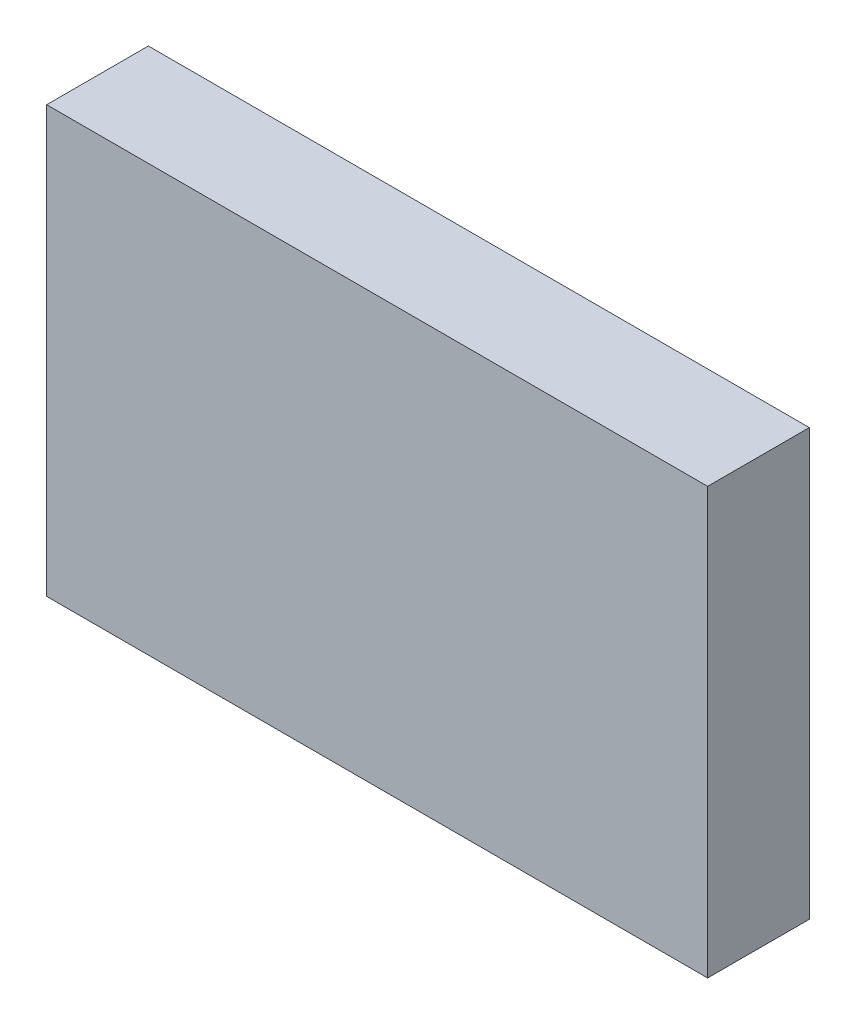
ISO-10303-21;
HEADER;
FILE_DESCRIPTION(('STEP AP214'),'2;1');
FILE_NAME('part.step','',(''),(''),'','','');
FILE_SCHEMA(('AUTOMOTIVE_DESIGN { 1 0 10303 214 1 1 1 1 }'));
ENDSEC;
DATA;
#1=APPLICATION_CONTEXT('core data for automotive mechanical design processes');
#2=APPLICATION_PROTOCOL_DEFINITION('international standard','automotive_design',2000,#1);
#3=PRODUCT_CONTEXT('',#1,'mechanical');
#4=PRODUCT('Part','Part','',(#3));
#5=PRODUCT_RELATED_PRODUCT_CATEGORY('part','',(#4));
#6=PRODUCT_DEFINITION_FORMATION('','',#4);
#7=PRODUCT_DEFINITION_CONTEXT('part definition',#1,'design');
#8=PRODUCT_DEFINITION('design','',#6,#7);
#9=PRODUCT_DEFINITION_SHAPE('','',#8);
#10=(LENGTH_UNIT() NAMED_UNIT(*) SI_UNIT(.MILLI.,.METRE.));
#11=(NAMED_UNIT(*) PLANE_ANGLE_UNIT() SI_UNIT($,.RADIAN.));
#12=(NAMED_UNIT(*) SI_UNIT($,.STERADIAN.) SOLID_ANGLE_UNIT());
#13=UNCERTAINTY_MEASURE_WITH_UNIT(LENGTH_MEASURE(1.E-05),#10,'distance_accuracy_value','');
#14=(GEOMETRIC_REPRESENTATION_CONTEXT(3) GLOBAL_UNCERTAINTY_ASSIGNED_CONTEXT((#13)) GLOBAL_UNIT_ASSIGNED_CONTEXT((#10,
#11,#12)) REPRESENTATION_CONTEXT('',''));
#15=CARTESIAN_POINT('',(0.,0.,0.));
#16=DIRECTION('',(0.,0.,1.));
#17=DIRECTION('',(1.,0.,0.));
#18=AXIS2_PLACEMENT_3D('',#15,#16,#17);
#19=CARTESIAN_POINT('',(0.,0.,8.));
#20=DIRECTION('',(1.,0.,0.));
#21=DIRECTION('',(0.,1.,0.));
#22=AXIS2_PLACEMENT_3D('',#19,#20,#21);
#23=PLANE('',#22);
#24=DIRECTION('',(0.,-1.,0.));
#25=VECTOR('',#24,1.);
#26=CARTESIAN_POINT('',(0.,0.,0.));
#27=LINE('',#26,#25);
#28=CARTESIAN_POINT('',(0.,0.,0.));
#29=VERTEX_POINT('',#28);
#30=CARTESIAN_POINT('',(0.,-33.5,0.));
#31=VERTEX_POINT('',#30);
#32=EDGE_CURVE('E102',#29,#31,#27,.T.);
#33=ORIENTED_EDGE('',*,*,#32,.T.);
#34=DIRECTION('',(0.,0.,-1.));
#35=VECTOR('',#34,1.);
#36=CARTESIAN_POINT('',(0.,-33.5,8.));
#37=LINE('',#36,#35);
#38=CARTESIAN_POINT('',(0.,-33.5,8.));
#39=VERTEX_POINT('',#38);
#40=EDGE_CURVE('E11',#39,#31,#37,.T.);
#41=ORIENTED_EDGE('',*,*,#40,.F.);
#42=DIRECTION('',(0.,-1.,0.));
#43=VECTOR('',#42,1.);
#44=CARTESIAN_POINT('',(0.,0.,8.));
#45=LINE('',#44,#43);
#46=CARTESIAN_POINT('',(0.,0.,8.));
#47=VERTEX_POINT('',#46);
#48=EDGE_CURVE('E90',#47,#39,#45,.T.);
#49=ORIENTED_EDGE('',*,*,#48,.F.);
#50=DIRECTION('',(0.,0.,-1.));
#51=VECTOR('',#50,1.);
#52=CARTESIAN_POINT('',(0.,0.,8.));
#53=LINE('',#52,#51);
#54=EDGE_CURVE('E98',#47,#29,#53,.T.);
#55=ORIENTED_EDGE('',*,*,#54,.T.);
#56=EDGE_LOOP('',(#33,#41,#49,#55));
#57=FACE_BOUND('',#56,.T.);
#58=ADVANCED_FACE('F39',(#57),#23,.F.);
#59=CARTESIAN_POINT('',(0.,-33.5,8.));
#60=DIRECTION('',(0.,1.,0.));
#61=DIRECTION('',(0.,0.,1.));
#62=AXIS2_PLACEMENT_3D('',#59,#60,#61);
#63=PLANE('',#62);
#64=DIRECTION('',(1.,0.,0.));
#65=VECTOR('',#64,1.);
#66=CARTESIAN_POINT('',(0.,-33.5,0.));
#67=LINE('',#66,#65);
#68=CARTESIAN_POINT('',(52.,-33.5,0.));
#69=VERTEX_POINT('',#68);
#70=EDGE_CURVE('E94',#31,#69,#67,.T.);
#71=ORIENTED_EDGE('',*,*,#70,.T.);
#72=DIRECTION('',(0.,0.,-1.));
#73=VECTOR('',#72,1.);
#74=CARTESIAN_POINT('',(52.,-33.5,8.));
#75=LINE('',#74,#73);
#76=CARTESIAN_POINT('',(52.,-33.5,8.));
#77=VERTEX_POINT('',#76);
#78=EDGE_CURVE('E47',#77,#69,#75,.T.);
#79=ORIENTED_EDGE('',*,*,#78,.F.);
#80=DIRECTION('',(1.,0.,0.));
#81=VECTOR('',#80,1.);
#82=CARTESIAN_POINT('',(0.,-33.5,8.));
#83=LINE('',#82,#81);
#84=EDGE_CURVE('E85',#39,#77,#83,.T.);
#85=ORIENTED_EDGE('',*,*,#84,.F.);
#86=ORIENTED_EDGE('',*,*,#40,.T.);
#87=EDGE_LOOP('',(#71,#79,#85,#86));
#88=FACE_BOUND('',#87,.T.);
#89=ADVANCED_FACE('F93',(#88),#63,.F.);
#90=CARTESIAN_POINT('',(52.,0.,8.));
#91=DIRECTION('',(-1.,0.,0.));
#92=DIRECTION('',(0.,-1.,0.));
#93=AXIS2_PLACEMENT_3D('',#90,#91,#92);
#94=PLANE('',#93);
#95=DIRECTION('',(0.,1.,0.));
#96=VECTOR('',#95,1.);
#97=CARTESIAN_POINT('',(52.,0.,0.));
#98=LINE('',#97,#96);
#99=CARTESIAN_POINT('',(52.,0.,0.));
#100=VERTEX_POINT('',#99);
#101=EDGE_CURVE('E72',#69,#100,#98,.T.);
#102=ORIENTED_EDGE('',*,*,#101,.T.);
#103=DIRECTION('',(0.,0.,-1.));
#104=VECTOR('',#103,1.);
#105=CARTESIAN_POINT('',(52.,0.,8.));
#106=LINE('',#105,#104);
#107=CARTESIAN_POINT('',(52.,0.,8.));
#108=VERTEX_POINT('',#107);
#109=EDGE_CURVE('E95',#108,#100,#106,.T.);
#110=ORIENTED_EDGE('',*,*,#109,.F.);
#111=DIRECTION('',(0.,1.,0.));
#112=VECTOR('',#111,1.);
#113=CARTESIAN_POINT('',(52.,0.,8.));
#114=LINE('',#113,#112);
#115=EDGE_CURVE('E88',#77,#108,#114,.T.);
#116=ORIENTED_EDGE('',*,*,#115,.F.);
#117=ORIENTED_EDGE('',*,*,#78,.T.);
#118=EDGE_LOOP('',(#102,#110,#116,#117));
#119=FACE_BOUND('',#118,.T.);
#120=ADVANCED_FACE('F96',(#119),#94,.F.);
#121=CARTESIAN_POINT('',(0.,0.,8.));
#122=DIRECTION('',(0.,-1.,0.));
#123=DIRECTION('',(0.,0.,-1.));
#124=AXIS2_PLACEMENT_3D('',#121,#122,#123);
#125=PLANE('',#124);
#126=DIRECTION('',(-1.,0.,0.));
#127=VECTOR('',#126,1.);
#128=CARTESIAN_POINT('',(0.,0.,0.));
#129=LINE('',#128,#127);
#130=EDGE_CURVE('E78',#100,#29,#129,.T.);
#131=ORIENTED_EDGE('',*,*,#130,.T.);
#132=ORIENTED_EDGE('',*,*,#54,.F.);
#133=DIRECTION('',(-1.,0.,0.));
#134=VECTOR('',#133,1.);
#135=CARTESIAN_POINT('',(0.,0.,8.));
#136=LINE('',#135,#134);
#137=EDGE_CURVE('E55',#108,#47,#136,.T.);
#138=ORIENTED_EDGE('',*,*,#137,.F.);
#139=ORIENTED_EDGE('',*,*,#109,.T.);
#140=EDGE_LOOP('',(#131,#132,#138,#139));
#141=FACE_BOUND('',#140,.T.);
#142=ADVANCED_FACE('F109',(#141),#125,.F.);
#143=CARTESIAN_POINT('',(0.,0.,8.));
#144=DIRECTION('',(0.,0.,1.));
#145=DIRECTION('',(1.,0.,0.));
#146=AXIS2_PLACEMENT_3D('',#143,#144,#145);
#147=PLANE('',#146);
#148=ORIENTED_EDGE('',*,*,#48,.T.);
#149=ORIENTED_EDGE('',*,*,#84,.T.);
#150=ORIENTED_EDGE('',*,*,#115,.T.);
#151=ORIENTED_EDGE('',*,*,#137,.T.);
#152=EDGE_LOOP('',(#148,#149,#150,#151));
#153=FACE_BOUND('',#152,.T.);
#154=ADVANCED_FACE('F86',(#153),#147,.T.);
#155=CARTESIAN_POINT('',(0.,0.,0.));
#156=DIRECTION('',(0.,0.,1.));
#157=DIRECTION('',(1.,0.,0.));
#158=AXIS2_PLACEMENT_3D('',#155,#156,#157);
#159=PLANE('',#158);
#160=ORIENTED_EDGE('',*,*,#32,.F.);
#161=ORIENTED_EDGE('',*,*,#130,.F.);
#162=ORIENTED_EDGE('',*,*,#101,.F.);
#163=ORIENTED_EDGE('',*,*,#70,.F.);
#164=EDGE_LOOP('',(#160,#161,#162,#163));
#165=FACE_BOUND('',#164,.T.);
#166=ADVANCED_FACE('F112',(#165),#159,.F.);
#167=CLOSED_SHELL('',(#58,#89,#120,#142,#154,#166));
#168=MANIFOLD_SOLID_BREP('B2',#167);
#169=ADVANCED_BREP_SHAPE_REPRESENTATION('',(#18,#168),#14);
#170=SHAPE_DEFINITION_REPRESENTATION(#9,#169);
ENDSEC;
END-ISO-10303-21;
